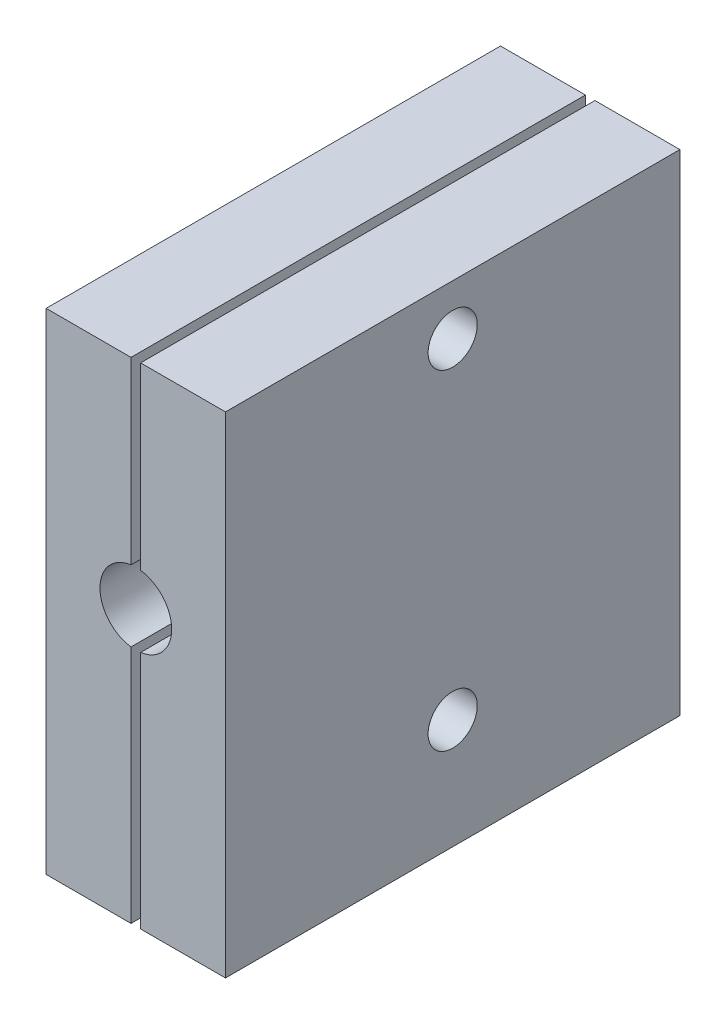
ISO-10303-21;
HEADER;
FILE_DESCRIPTION(('STEP AP214'),'2;1');
FILE_NAME('part.step','',(''),(''),'','','');
FILE_SCHEMA(('AUTOMOTIVE_DESIGN { 1 0 10303 214 1 1 1 1 }'));
ENDSEC;
DATA;
#1=APPLICATION_CONTEXT('core data for automotive mechanical design processes');
#2=APPLICATION_PROTOCOL_DEFINITION('international standard','automotive_design',2000,#1);
#3=PRODUCT_CONTEXT('',#1,'mechanical');
#4=PRODUCT('Part','Part','',(#3));
#5=PRODUCT_RELATED_PRODUCT_CATEGORY('part','',(#4));
#6=PRODUCT_DEFINITION_FORMATION('','',#4);
#7=PRODUCT_DEFINITION_CONTEXT('part definition',#1,'design');
#8=PRODUCT_DEFINITION('design','',#6,#7);
#9=PRODUCT_DEFINITION_SHAPE('','',#8);
#10=(LENGTH_UNIT() NAMED_UNIT(*) SI_UNIT(.MILLI.,.METRE.));
#11=(NAMED_UNIT(*) PLANE_ANGLE_UNIT() SI_UNIT($,.RADIAN.));
#12=(NAMED_UNIT(*) SI_UNIT($,.STERADIAN.) SOLID_ANGLE_UNIT());
#13=UNCERTAINTY_MEASURE_WITH_UNIT(LENGTH_MEASURE(1.E-05),#10,'distance_accuracy_value','');
#14=(GEOMETRIC_REPRESENTATION_CONTEXT(3) GLOBAL_UNCERTAINTY_ASSIGNED_CONTEXT((#13)) GLOBAL_UNIT_ASSIGNED_CONTEXT((#10,
#11,#12)) REPRESENTATION_CONTEXT('',''));
#15=CARTESIAN_POINT('',(0.,0.,0.));
#16=DIRECTION('',(0.,0.,1.));
#17=DIRECTION('',(1.,0.,0.));
#18=AXIS2_PLACEMENT_3D('',#15,#16,#17);
#19=CARTESIAN_POINT('',(0.,0.,30.1625));
#20=DIRECTION('',(0.,0.,-1.));
#21=DIRECTION('',(-1.,0.,0.));
#22=AXIS2_PLACEMENT_3D('',#19,#20,#21);
#23=PLANE('',#22);
#24=DIRECTION('',(-1.,0.,0.));
#25=VECTOR('',#24,1.);
#26=CARTESIAN_POINT('',(-11.90625,32.54375,30.1625));
#27=LINE('',#26,#25);
#28=CARTESIAN_POINT('',(11.90625,32.54375,30.1625));
#29=VERTEX_POINT('',#28);
#30=CARTESIAN_POINT('',(0.635,32.54375,30.1625));
#31=VERTEX_POINT('',#30);
#32=EDGE_CURVE('E107',#29,#31,#27,.T.);
#33=ORIENTED_EDGE('',*,*,#32,.T.);
#34=DIRECTION('',(0.,1.,0.));
#35=VECTOR('',#34,1.);
#36=CARTESIAN_POINT('',(0.635,-32.54375,30.1625));
#37=LINE('',#36,#35);
#38=CARTESIAN_POINT('',(0.635,8.68872682727364,30.1625));
#39=VERTEX_POINT('',#38);
#40=EDGE_CURVE('E54',#39,#31,#37,.T.);
#41=ORIENTED_EDGE('',*,*,#40,.F.);
#42=CARTESIAN_POINT('',(0.,3.96875000000001,30.1625));
#43=DIRECTION('',(0.,0.,1.));
#44=DIRECTION('',(1.,0.,0.));
#45=AXIS2_PLACEMENT_3D('',#42,#43,#44);
#46=CIRCLE('',#45,4.7625);
#47=CARTESIAN_POINT('',(0.635,-0.751226827273615,30.1625));
#48=VERTEX_POINT('',#47);
#49=EDGE_CURVE('E121',#48,#39,#46,.T.);
#50=ORIENTED_EDGE('',*,*,#49,.F.);
#51=CARTESIAN_POINT('',(0.635,-32.54375,30.1625));
#52=VERTEX_POINT('',#51);
#53=EDGE_CURVE('E12',#52,#48,#37,.T.);
#54=ORIENTED_EDGE('',*,*,#53,.F.);
#55=DIRECTION('',(1.,0.,0.));
#56=VECTOR('',#55,1.);
#57=CARTESIAN_POINT('',(-11.90625,-32.54375,30.1625));
#58=LINE('',#57,#56);
#59=CARTESIAN_POINT('',(11.90625,-32.54375,30.1625));
#60=VERTEX_POINT('',#59);
#61=EDGE_CURVE('E115',#52,#60,#58,.T.);
#62=ORIENTED_EDGE('',*,*,#61,.T.);
#63=DIRECTION('',(0.,1.,0.));
#64=VECTOR('',#63,1.);
#65=CARTESIAN_POINT('',(11.90625,-32.54375,30.1625));
#66=LINE('',#65,#64);
#67=EDGE_CURVE('E113',#60,#29,#66,.T.);
#68=ORIENTED_EDGE('',*,*,#67,.T.);
#69=EDGE_LOOP('',(#33,#41,#50,#54,#62,#68));
#70=FACE_BOUND('',#69,.T.);
#71=ADVANCED_FACE('F42',(#70),#23,.F.);
#72=CARTESIAN_POINT('',(0.,0.,-30.1625));
#73=DIRECTION('',(0.,0.,-1.));
#74=DIRECTION('',(-1.,0.,0.));
#75=AXIS2_PLACEMENT_3D('',#72,#73,#74);
#76=PLANE('',#75);
#77=DIRECTION('',(0.,1.,0.));
#78=VECTOR('',#77,1.);
#79=CARTESIAN_POINT('',(0.635,-32.54375,-30.1625));
#80=LINE('',#79,#78);
#81=CARTESIAN_POINT('',(0.635,8.68872682727364,-30.1625));
#82=VERTEX_POINT('',#81);
#83=CARTESIAN_POINT('',(0.635,32.54375,-30.1625));
#84=VERTEX_POINT('',#83);
#85=EDGE_CURVE('E138',#82,#84,#80,.T.);
#86=ORIENTED_EDGE('',*,*,#85,.T.);
#87=DIRECTION('',(-1.,0.,0.));
#88=VECTOR('',#87,1.);
#89=CARTESIAN_POINT('',(-11.90625,32.54375,-30.1625));
#90=LINE('',#89,#88);
#91=CARTESIAN_POINT('',(11.90625,32.54375,-30.1625));
#92=VERTEX_POINT('',#91);
#93=EDGE_CURVE('E109',#92,#84,#90,.T.);
#94=ORIENTED_EDGE('',*,*,#93,.F.);
#95=DIRECTION('',(0.,1.,0.));
#96=VECTOR('',#95,1.);
#97=CARTESIAN_POINT('',(11.90625,-32.54375,-30.1625));
#98=LINE('',#97,#96);
#99=CARTESIAN_POINT('',(11.90625,-32.54375,-30.1625));
#100=VERTEX_POINT('',#99);
#101=EDGE_CURVE('E146',#100,#92,#98,.T.);
#102=ORIENTED_EDGE('',*,*,#101,.F.);
#103=DIRECTION('',(1.,0.,0.));
#104=VECTOR('',#103,1.);
#105=CARTESIAN_POINT('',(-11.90625,-32.54375,-30.1625));
#106=LINE('',#105,#104);
#107=CARTESIAN_POINT('',(0.635,-32.54375,-30.1625));
#108=VERTEX_POINT('',#107);
#109=EDGE_CURVE('E119',#108,#100,#106,.T.);
#110=ORIENTED_EDGE('',*,*,#109,.F.);
#111=CARTESIAN_POINT('',(0.635,-0.751226827273615,-30.1625));
#112=VERTEX_POINT('',#111);
#113=EDGE_CURVE('E136',#108,#112,#80,.T.);
#114=ORIENTED_EDGE('',*,*,#113,.T.);
#115=CARTESIAN_POINT('',(0.,3.96875000000001,-30.1625));
#116=DIRECTION('',(0.,0.,1.));
#117=DIRECTION('',(1.,0.,0.));
#118=AXIS2_PLACEMENT_3D('',#115,#116,#117);
#119=CIRCLE('',#118,4.7625);
#120=EDGE_CURVE('E46',#112,#82,#119,.T.);
#121=ORIENTED_EDGE('',*,*,#120,.T.);
#122=EDGE_LOOP('',(#86,#94,#102,#110,#114,#121));
#123=FACE_BOUND('',#122,.T.);
#124=ADVANCED_FACE('F167',(#123),#76,.T.);
#125=CARTESIAN_POINT('',(-11.90625,32.54375,30.1625));
#126=DIRECTION('',(0.,-1.,0.));
#127=DIRECTION('',(0.,0.,-1.));
#128=AXIS2_PLACEMENT_3D('',#125,#126,#127);
#129=PLANE('',#128);
#130=ORIENTED_EDGE('',*,*,#93,.T.);
#131=DIRECTION('',(0.,0.,1.));
#132=VECTOR('',#131,1.);
#133=CARTESIAN_POINT('',(0.635,32.54375,-30.1625));
#134=LINE('',#133,#132);
#135=EDGE_CURVE('E91',#84,#31,#134,.T.);
#136=ORIENTED_EDGE('',*,*,#135,.T.);
#137=ORIENTED_EDGE('',*,*,#32,.F.);
#138=DIRECTION('',(0.,0.,-1.));
#139=VECTOR('',#138,1.);
#140=CARTESIAN_POINT('',(11.90625,32.54375,30.1625));
#141=LINE('',#140,#139);
#142=EDGE_CURVE('E110',#29,#92,#141,.T.);
#143=ORIENTED_EDGE('',*,*,#142,.T.);
#144=EDGE_LOOP('',(#130,#136,#137,#143));
#145=FACE_BOUND('',#144,.T.);
#146=ADVANCED_FACE('F105',(#145),#129,.F.);
#147=CARTESIAN_POINT('',(-11.90625,-32.54375,30.1625));
#148=DIRECTION('',(0.,1.,0.));
#149=DIRECTION('',(0.,0.,1.));
#150=AXIS2_PLACEMENT_3D('',#147,#148,#149);
#151=PLANE('',#150);
#152=ORIENTED_EDGE('',*,*,#61,.F.);
#153=DIRECTION('',(0.,0.,1.));
#154=VECTOR('',#153,1.);
#155=CARTESIAN_POINT('',(0.635,-32.54375,-30.1625));
#156=LINE('',#155,#154);
#157=EDGE_CURVE('E52',#108,#52,#156,.T.);
#158=ORIENTED_EDGE('',*,*,#157,.F.);
#159=ORIENTED_EDGE('',*,*,#109,.T.);
#160=DIRECTION('',(0.,0.,-1.));
#161=VECTOR('',#160,1.);
#162=CARTESIAN_POINT('',(11.90625,-32.54375,30.1625));
#163=LINE('',#162,#161);
#164=EDGE_CURVE('E161',#60,#100,#163,.T.);
#165=ORIENTED_EDGE('',*,*,#164,.F.);
#166=EDGE_LOOP('',(#152,#158,#159,#165));
#167=FACE_BOUND('',#166,.T.);
#168=ADVANCED_FACE('F159',(#167),#151,.F.);
#169=CARTESIAN_POINT('',(0.,3.96875000000001,30.1625));
#170=DIRECTION('',(0.,0.,-1.));
#171=DIRECTION('',(-1.,0.,0.));
#172=AXIS2_PLACEMENT_3D('',#169,#170,#171);
#173=CYLINDRICAL_SURFACE('',#172,4.7625);
#174=DIRECTION('',(0.,0.,-1.));
#175=VECTOR('',#174,1.);
#176=CARTESIAN_POINT('',(0.635,-0.751226827273614,30.1625));
#177=LINE('',#176,#175);
#178=EDGE_CURVE('E102',#48,#112,#177,.T.);
#179=ORIENTED_EDGE('',*,*,#178,.F.);
#180=ORIENTED_EDGE('',*,*,#49,.T.);
#181=DIRECTION('',(0.,0.,-1.));
#182=VECTOR('',#181,1.);
#183=CARTESIAN_POINT('',(0.635,8.68872682727364,30.1625));
#184=LINE('',#183,#182);
#185=EDGE_CURVE('E97',#82,#39,#184,.F.);
#186=ORIENTED_EDGE('',*,*,#185,.F.);
#187=ORIENTED_EDGE('',*,*,#120,.F.);
#188=EDGE_LOOP('',(#179,#180,#186,#187));
#189=FACE_BOUND('',#188,.T.);
#190=ADVANCED_FACE('F155',(#189),#173,.F.);
#191=CARTESIAN_POINT('',(-11.90625,-17.93875,0.));
#192=DIRECTION('',(-1.,0.,0.));
#193=DIRECTION('',(0.,0.,1.));
#194=AXIS2_PLACEMENT_3D('',#191,#192,#193);
#195=CYLINDRICAL_SURFACE('',#194,3.2639);
#196=CARTESIAN_POINT('',(0.635,-17.93875,0.));
#197=DIRECTION('',(1.,0.,0.));
#198=DIRECTION('',(0.,0.,-1.));
#199=AXIS2_PLACEMENT_3D('',#196,#197,#198);
#200=CIRCLE('',#199,3.2639);
#201=CARTESIAN_POINT('',(0.635,-17.93875,-3.26389999999999));
#202=VERTEX_POINT('',#201);
#203=EDGE_CURVE('E122',#202,#202,#200,.F.);
#204=ORIENTED_EDGE('',*,*,#203,.T.);
#205=EDGE_LOOP('',(#204));
#206=FACE_BOUND('',#205,.T.);
#207=CARTESIAN_POINT('',(11.90625,-17.93875,0.));
#208=DIRECTION('',(-1.,0.,0.));
#209=DIRECTION('',(0.,0.,1.));
#210=AXIS2_PLACEMENT_3D('',#207,#208,#209);
#211=CIRCLE('',#210,3.2639);
#212=CARTESIAN_POINT('',(11.90625,-17.93875,3.2639));
#213=VERTEX_POINT('',#212);
#214=EDGE_CURVE('E148',#213,#213,#211,.T.);
#215=ORIENTED_EDGE('',*,*,#214,.F.);
#216=EDGE_LOOP('',(#215));
#217=FACE_BOUND('',#216,.T.);
#218=ADVANCED_FACE('F177',(#206,#217),#195,.F.);
#219=CARTESIAN_POINT('',(-11.90625,25.87625,0.));
#220=DIRECTION('',(-1.,0.,0.));
#221=DIRECTION('',(0.,0.,1.));
#222=AXIS2_PLACEMENT_3D('',#219,#220,#221);
#223=CYLINDRICAL_SURFACE('',#222,3.2639);
#224=CARTESIAN_POINT('',(0.635,25.87625,0.));
#225=DIRECTION('',(1.,0.,0.));
#226=DIRECTION('',(0.,0.,-1.));
#227=AXIS2_PLACEMENT_3D('',#224,#225,#226);
#228=CIRCLE('',#227,3.2639);
#229=CARTESIAN_POINT('',(0.635,25.87625,-3.26389999999999));
#230=VERTEX_POINT('',#229);
#231=EDGE_CURVE('E125',#230,#230,#228,.F.);
#232=ORIENTED_EDGE('',*,*,#231,.T.);
#233=EDGE_LOOP('',(#232));
#234=FACE_BOUND('',#233,.T.);
#235=CARTESIAN_POINT('',(11.90625,25.87625,0.));
#236=DIRECTION('',(-1.,0.,0.));
#237=DIRECTION('',(0.,0.,1.));
#238=AXIS2_PLACEMENT_3D('',#235,#236,#237);
#239=CIRCLE('',#238,3.2639);
#240=CARTESIAN_POINT('',(11.90625,25.87625,3.2639));
#241=VERTEX_POINT('',#240);
#242=EDGE_CURVE('E130',#241,#241,#239,.T.);
#243=ORIENTED_EDGE('',*,*,#242,.F.);
#244=EDGE_LOOP('',(#243));
#245=FACE_BOUND('',#244,.T.);
#246=ADVANCED_FACE('F44',(#234,#245),#223,.F.);
#247=CARTESIAN_POINT('',(11.90625,-32.54375,30.1625));
#248=DIRECTION('',(-1.,0.,0.));
#249=DIRECTION('',(0.,-1.,0.));
#250=AXIS2_PLACEMENT_3D('',#247,#248,#249);
#251=PLANE('',#250);
#252=ORIENTED_EDGE('',*,*,#242,.T.);
#253=EDGE_LOOP('',(#252));
#254=FACE_BOUND('',#253,.T.);
#255=ORIENTED_EDGE('',*,*,#214,.T.);
#256=EDGE_LOOP('',(#255));
#257=FACE_BOUND('',#256,.T.);
#258=ORIENTED_EDGE('',*,*,#101,.T.);
#259=ORIENTED_EDGE('',*,*,#142,.F.);
#260=ORIENTED_EDGE('',*,*,#67,.F.);
#261=ORIENTED_EDGE('',*,*,#164,.T.);
#262=EDGE_LOOP('',(#258,#259,#260,#261));
#263=FACE_BOUND('',#262,.T.);
#264=ADVANCED_FACE('F165',(#254,#257,#263),#251,.F.);
#265=CARTESIAN_POINT('',(0.635,-32.54375,-30.1625));
#266=DIRECTION('',(1.,0.,0.));
#267=DIRECTION('',(0.,0.,-1.));
#268=AXIS2_PLACEMENT_3D('',#265,#266,#267);
#269=PLANE('',#268);
#270=ORIENTED_EDGE('',*,*,#185,.T.);
#271=ORIENTED_EDGE('',*,*,#40,.T.);
#272=ORIENTED_EDGE('',*,*,#135,.F.);
#273=ORIENTED_EDGE('',*,*,#85,.F.);
#274=EDGE_LOOP('',(#270,#271,#272,#273));
#275=FACE_BOUND('',#274,.T.);
#276=ORIENTED_EDGE('',*,*,#231,.F.);
#277=EDGE_LOOP('',(#276));
#278=FACE_BOUND('',#277,.T.);
#279=ADVANCED_FACE('F94',(#275,#278),#269,.F.);
#280=ORIENTED_EDGE('',*,*,#178,.T.);
#281=ORIENTED_EDGE('',*,*,#113,.F.);
#282=ORIENTED_EDGE('',*,*,#157,.T.);
#283=ORIENTED_EDGE('',*,*,#53,.T.);
#284=EDGE_LOOP('',(#280,#281,#282,#283));
#285=FACE_BOUND('',#284,.T.);
#286=ORIENTED_EDGE('',*,*,#203,.F.);
#287=EDGE_LOOP('',(#286));
#288=FACE_BOUND('',#287,.T.);
#289=ADVANCED_FACE('F152',(#285,#288),#269,.F.);
#290=CLOSED_SHELL('',(#71,#124,#146,#168,#190,#218,#246,#264,#279,#289));
#291=MANIFOLD_SOLID_BREP('B2',#290);
#292=CARTESIAN_POINT('',(0.,3.96875000000001,30.1625));
#293=DIRECTION('',(0.,0.,-1.));
#294=DIRECTION('',(-1.,0.,0.));
#295=AXIS2_PLACEMENT_3D('',#292,#293,#294);
#296=CYLINDRICAL_SURFACE('',#295,4.7625);
#297=DIRECTION('',(0.,0.,-1.));
#298=VECTOR('',#297,1.);
#299=CARTESIAN_POINT('',(-0.635,8.68872682727364,30.1625));
#300=LINE('',#299,#298);
#301=CARTESIAN_POINT('',(-0.635,8.68872682727364,30.1625));
#302=VERTEX_POINT('',#301);
#303=CARTESIAN_POINT('',(-0.635,8.68872682727364,-30.1625));
#304=VERTEX_POINT('',#303);
#305=EDGE_CURVE('E367',#302,#304,#300,.T.);
#306=ORIENTED_EDGE('',*,*,#305,.F.);
#307=CARTESIAN_POINT('',(0.,3.96875000000001,30.1625));
#308=DIRECTION('',(0.,0.,1.));
#309=DIRECTION('',(1.,0.,0.));
#310=AXIS2_PLACEMENT_3D('',#307,#308,#309);
#311=CIRCLE('',#310,4.7625);
#312=CARTESIAN_POINT('',(-0.635,-0.751226827273615,30.1625));
#313=VERTEX_POINT('',#312);
#314=EDGE_CURVE('E326',#302,#313,#311,.T.);
#315=ORIENTED_EDGE('',*,*,#314,.T.);
#316=DIRECTION('',(0.,0.,-1.));
#317=VECTOR('',#316,1.);
#318=CARTESIAN_POINT('',(-0.635,-0.751226827273615,30.1625));
#319=LINE('',#318,#317);
#320=CARTESIAN_POINT('',(-0.635,-0.751226827273615,-30.1625));
#321=VERTEX_POINT('',#320);
#322=EDGE_CURVE('E365',#321,#313,#319,.F.);
#323=ORIENTED_EDGE('',*,*,#322,.F.);
#324=CARTESIAN_POINT('',(0.,3.96875000000001,-30.1625));
#325=DIRECTION('',(0.,0.,1.));
#326=DIRECTION('',(1.,0.,0.));
#327=AXIS2_PLACEMENT_3D('',#324,#325,#326);
#328=CIRCLE('',#327,4.7625);
#329=EDGE_CURVE('E339',#304,#321,#328,.T.);
#330=ORIENTED_EDGE('',*,*,#329,.F.);
#331=EDGE_LOOP('',(#306,#315,#323,#330));
#332=FACE_BOUND('',#331,.T.);
#333=ADVANCED_FACE('F256',(#332),#296,.F.);
#334=CARTESIAN_POINT('',(-11.90625,32.54375,30.1625));
#335=DIRECTION('',(0.,-1.,0.));
#336=DIRECTION('',(0.,0.,-1.));
#337=AXIS2_PLACEMENT_3D('',#334,#335,#336);
#338=PLANE('',#337);
#339=DIRECTION('',(-1.,0.,0.));
#340=VECTOR('',#339,1.);
#341=CARTESIAN_POINT('',(-11.90625,32.54375,30.1625));
#342=LINE('',#341,#340);
#343=CARTESIAN_POINT('',(-0.635,32.54375,30.1625));
#344=VERTEX_POINT('',#343);
#345=CARTESIAN_POINT('',(-11.90625,32.54375,30.1625));
#346=VERTEX_POINT('',#345);
#347=EDGE_CURVE('E322',#344,#346,#342,.T.);
#348=ORIENTED_EDGE('',*,*,#347,.F.);
#349=DIRECTION('',(0.,0.,1.));
#350=VECTOR('',#349,1.);
#351=CARTESIAN_POINT('',(-0.635,32.54375,-30.1625));
#352=LINE('',#351,#350);
#353=CARTESIAN_POINT('',(-0.635,32.54375,-30.1625));
#354=VERTEX_POINT('',#353);
#355=EDGE_CURVE('E308',#354,#344,#352,.T.);
#356=ORIENTED_EDGE('',*,*,#355,.F.);
#357=DIRECTION('',(-1.,0.,0.));
#358=VECTOR('',#357,1.);
#359=CARTESIAN_POINT('',(-11.90625,32.54375,-30.1625));
#360=LINE('',#359,#358);
#361=CARTESIAN_POINT('',(-11.90625,32.54375,-30.1625));
#362=VERTEX_POINT('',#361);
#363=EDGE_CURVE('E343',#354,#362,#360,.T.);
#364=ORIENTED_EDGE('',*,*,#363,.T.);
#365=DIRECTION('',(0.,0.,-1.));
#366=VECTOR('',#365,1.);
#367=CARTESIAN_POINT('',(-11.90625,32.54375,30.1625));
#368=LINE('',#367,#366);
#369=EDGE_CURVE('E40',#346,#362,#368,.T.);
#370=ORIENTED_EDGE('',*,*,#369,.F.);
#371=EDGE_LOOP('',(#348,#356,#364,#370));
#372=FACE_BOUND('',#371,.T.);
#373=ADVANCED_FACE('F258',(#372),#338,.F.);
#374=CARTESIAN_POINT('',(-11.90625,-32.54375,30.1625));
#375=DIRECTION('',(0.,1.,0.));
#376=DIRECTION('',(0.,0.,1.));
#377=AXIS2_PLACEMENT_3D('',#374,#375,#376);
#378=PLANE('',#377);
#379=DIRECTION('',(1.,0.,0.));
#380=VECTOR('',#379,1.);
#381=CARTESIAN_POINT('',(-11.90625,-32.54375,-30.1625));
#382=LINE('',#381,#380);
#383=CARTESIAN_POINT('',(-11.90625,-32.54375,-30.1625));
#384=VERTEX_POINT('',#383);
#385=CARTESIAN_POINT('',(-0.635,-32.54375,-30.1625));
#386=VERTEX_POINT('',#385);
#387=EDGE_CURVE('E331',#384,#386,#382,.T.);
#388=ORIENTED_EDGE('',*,*,#387,.T.);
#389=DIRECTION('',(0.,0.,1.));
#390=VECTOR('',#389,1.);
#391=CARTESIAN_POINT('',(-0.635,-32.54375,-30.1625));
#392=LINE('',#391,#390);
#393=CARTESIAN_POINT('',(-0.635,-32.54375,30.1625));
#394=VERTEX_POINT('',#393);
#395=EDGE_CURVE('E316',#386,#394,#392,.T.);
#396=ORIENTED_EDGE('',*,*,#395,.T.);
#397=DIRECTION('',(1.,0.,0.));
#398=VECTOR('',#397,1.);
#399=CARTESIAN_POINT('',(-11.90625,-32.54375,30.1625));
#400=LINE('',#399,#398);
#401=CARTESIAN_POINT('',(-11.90625,-32.54375,30.1625));
#402=VERTEX_POINT('',#401);
#403=EDGE_CURVE('E333',#402,#394,#400,.T.);
#404=ORIENTED_EDGE('',*,*,#403,.F.);
#405=DIRECTION('',(0.,0.,-1.));
#406=VECTOR('',#405,1.);
#407=CARTESIAN_POINT('',(-11.90625,-32.54375,30.1625));
#408=LINE('',#407,#406);
#409=EDGE_CURVE('E265',#402,#384,#408,.T.);
#410=ORIENTED_EDGE('',*,*,#409,.T.);
#411=EDGE_LOOP('',(#388,#396,#404,#410));
#412=FACE_BOUND('',#411,.T.);
#413=ADVANCED_FACE('F351',(#412),#378,.F.);
#414=CARTESIAN_POINT('',(0.,0.,-30.1625));
#415=DIRECTION('',(0.,0.,-1.));
#416=DIRECTION('',(-1.,0.,0.));
#417=AXIS2_PLACEMENT_3D('',#414,#415,#416);
#418=PLANE('',#417);
#419=DIRECTION('',(0.,-1.,0.));
#420=VECTOR('',#419,1.);
#421=CARTESIAN_POINT('',(-0.635,-32.54375,-30.1625));
#422=LINE('',#421,#420);
#423=EDGE_CURVE('E272',#321,#386,#422,.T.);
#424=ORIENTED_EDGE('',*,*,#423,.T.);
#425=ORIENTED_EDGE('',*,*,#387,.F.);
#426=DIRECTION('',(0.,-1.,0.));
#427=VECTOR('',#426,1.);
#428=CARTESIAN_POINT('',(-11.90625,-32.54375,-30.1625));
#429=LINE('',#428,#427);
#430=EDGE_CURVE('E336',#362,#384,#429,.T.);
#431=ORIENTED_EDGE('',*,*,#430,.F.);
#432=ORIENTED_EDGE('',*,*,#363,.F.);
#433=EDGE_CURVE('E312',#354,#304,#422,.T.);
#434=ORIENTED_EDGE('',*,*,#433,.T.);
#435=ORIENTED_EDGE('',*,*,#329,.T.);
#436=EDGE_LOOP('',(#424,#425,#431,#432,#434,#435));
#437=FACE_BOUND('',#436,.T.);
#438=ADVANCED_FACE('F356',(#437),#418,.T.);
#439=CARTESIAN_POINT('',(0.,0.,30.1625));
#440=DIRECTION('',(0.,0.,-1.));
#441=DIRECTION('',(-1.,0.,0.));
#442=AXIS2_PLACEMENT_3D('',#439,#440,#441);
#443=PLANE('',#442);
#444=ORIENTED_EDGE('',*,*,#403,.T.);
#445=DIRECTION('',(0.,-1.,0.));
#446=VECTOR('',#445,1.);
#447=CARTESIAN_POINT('',(-0.635,-32.54375,30.1625));
#448=LINE('',#447,#446);
#449=EDGE_CURVE('E327',#313,#394,#448,.T.);
#450=ORIENTED_EDGE('',*,*,#449,.F.);
#451=ORIENTED_EDGE('',*,*,#314,.F.);
#452=EDGE_CURVE('E280',#344,#302,#448,.T.);
#453=ORIENTED_EDGE('',*,*,#452,.F.);
#454=ORIENTED_EDGE('',*,*,#347,.T.);
#455=DIRECTION('',(0.,-1.,0.));
#456=VECTOR('',#455,1.);
#457=CARTESIAN_POINT('',(-11.90625,-32.54375,30.1625));
#458=LINE('',#457,#456);
#459=EDGE_CURVE('E330',#346,#402,#458,.T.);
#460=ORIENTED_EDGE('',*,*,#459,.T.);
#461=EDGE_LOOP('',(#444,#450,#451,#453,#454,#460));
#462=FACE_BOUND('',#461,.T.);
#463=ADVANCED_FACE('F321',(#462),#443,.F.);
#464=CARTESIAN_POINT('',(-11.90625,-17.93875,0.));
#465=DIRECTION('',(-1.,0.,0.));
#466=DIRECTION('',(0.,0.,1.));
#467=AXIS2_PLACEMENT_3D('',#464,#465,#466);
#468=CYLINDRICAL_SURFACE('',#467,3.2639);
#469=CARTESIAN_POINT('',(-0.635,-17.93875,0.));
#470=DIRECTION('',(-1.,0.,0.));
#471=DIRECTION('',(0.,0.,1.));
#472=AXIS2_PLACEMENT_3D('',#469,#470,#471);
#473=CIRCLE('',#472,3.2639);
#474=CARTESIAN_POINT('',(-0.635,-17.93875,3.2639));
#475=VERTEX_POINT('',#474);
#476=EDGE_CURVE('E362',#475,#475,#473,.F.);
#477=ORIENTED_EDGE('',*,*,#476,.T.);
#478=EDGE_LOOP('',(#477));
#479=FACE_BOUND('',#478,.T.);
#480=CARTESIAN_POINT('',(-11.90625,-17.93875,0.));
#481=DIRECTION('',(-1.,0.,0.));
#482=DIRECTION('',(0.,0.,1.));
#483=AXIS2_PLACEMENT_3D('',#480,#481,#482);
#484=CIRCLE('',#483,3.2639);
#485=CARTESIAN_POINT('',(-11.90625,-17.93875,3.2639));
#486=VERTEX_POINT('',#485);
#487=EDGE_CURVE('E372',#486,#486,#484,.T.);
#488=ORIENTED_EDGE('',*,*,#487,.T.);
#489=EDGE_LOOP('',(#488));
#490=FACE_BOUND('',#489,.T.);
#491=ADVANCED_FACE('F382',(#479,#490),#468,.F.);
#492=CARTESIAN_POINT('',(-11.90625,-32.54375,30.1625));
#493=DIRECTION('',(1.,0.,0.));
#494=DIRECTION('',(0.,1.,0.));
#495=AXIS2_PLACEMENT_3D('',#492,#493,#494);
#496=PLANE('',#495);
#497=CARTESIAN_POINT('',(-11.90625,25.87625,0.));
#498=DIRECTION('',(-1.,0.,0.));
#499=DIRECTION('',(0.,0.,1.));
#500=AXIS2_PLACEMENT_3D('',#497,#498,#499);
#501=CIRCLE('',#500,3.2639);
#502=CARTESIAN_POINT('',(-11.90625,25.87625,3.2639));
#503=VERTEX_POINT('',#502);
#504=EDGE_CURVE('E369',#503,#503,#501,.T.);
#505=ORIENTED_EDGE('',*,*,#504,.F.);
#506=EDGE_LOOP('',(#505));
#507=FACE_BOUND('',#506,.T.);
#508=ORIENTED_EDGE('',*,*,#487,.F.);
#509=EDGE_LOOP('',(#508));
#510=FACE_BOUND('',#509,.T.);
#511=ORIENTED_EDGE('',*,*,#430,.T.);
#512=ORIENTED_EDGE('',*,*,#409,.F.);
#513=ORIENTED_EDGE('',*,*,#459,.F.);
#514=ORIENTED_EDGE('',*,*,#369,.T.);
#515=EDGE_LOOP('',(#511,#512,#513,#514));
#516=FACE_BOUND('',#515,.T.);
#517=ADVANCED_FACE('F375',(#507,#510,#516),#496,.F.);
#518=CARTESIAN_POINT('',(-11.90625,25.87625,0.));
#519=DIRECTION('',(-1.,0.,0.));
#520=DIRECTION('',(0.,0.,1.));
#521=AXIS2_PLACEMENT_3D('',#518,#519,#520);
#522=CYLINDRICAL_SURFACE('',#521,3.2639);
#523=CARTESIAN_POINT('',(-0.635,25.87625,0.));
#524=DIRECTION('',(-1.,0.,0.));
#525=DIRECTION('',(0.,0.,1.));
#526=AXIS2_PLACEMENT_3D('',#523,#524,#525);
#527=CIRCLE('',#526,3.2639);
#528=CARTESIAN_POINT('',(-0.635,25.87625,3.2639));
#529=VERTEX_POINT('',#528);
#530=EDGE_CURVE('E260',#529,#529,#527,.F.);
#531=ORIENTED_EDGE('',*,*,#530,.T.);
#532=EDGE_LOOP('',(#531));
#533=FACE_BOUND('',#532,.T.);
#534=ORIENTED_EDGE('',*,*,#504,.T.);
#535=EDGE_LOOP('',(#534));
#536=FACE_BOUND('',#535,.T.);
#537=ADVANCED_FACE('F389',(#533,#536),#522,.F.);
#538=CARTESIAN_POINT('',(-0.635,-32.54375,-30.1625));
#539=DIRECTION('',(-1.,0.,0.));
#540=DIRECTION('',(0.,0.,1.));
#541=AXIS2_PLACEMENT_3D('',#538,#539,#540);
#542=PLANE('',#541);
#543=ORIENTED_EDGE('',*,*,#305,.T.);
#544=ORIENTED_EDGE('',*,*,#433,.F.);
#545=ORIENTED_EDGE('',*,*,#355,.T.);
#546=ORIENTED_EDGE('',*,*,#452,.T.);
#547=EDGE_LOOP('',(#543,#544,#545,#546));
#548=FACE_BOUND('',#547,.T.);
#549=ORIENTED_EDGE('',*,*,#530,.F.);
#550=EDGE_LOOP('',(#549));
#551=FACE_BOUND('',#550,.T.);
#552=ADVANCED_FACE('F309',(#548,#551),#542,.F.);
#553=ORIENTED_EDGE('',*,*,#322,.T.);
#554=ORIENTED_EDGE('',*,*,#449,.T.);
#555=ORIENTED_EDGE('',*,*,#395,.F.);
#556=ORIENTED_EDGE('',*,*,#423,.F.);
#557=EDGE_LOOP('',(#553,#554,#555,#556));
#558=FACE_BOUND('',#557,.T.);
#559=ORIENTED_EDGE('',*,*,#476,.F.);
#560=EDGE_LOOP('',(#559));
#561=FACE_BOUND('',#560,.T.);
#562=ADVANCED_FACE('F376',(#558,#561),#542,.F.);
#563=CLOSED_SHELL('',(#333,#373,#413,#438,#463,#491,#517,#537,#552,#562));
#564=MANIFOLD_SOLID_BREP('B6',#563);
#565=ADVANCED_BREP_SHAPE_REPRESENTATION('',(#18,#291,#564),#14);
#566=SHAPE_DEFINITION_REPRESENTATION(#9,#565);
ENDSEC;
END-ISO-10303-21;
